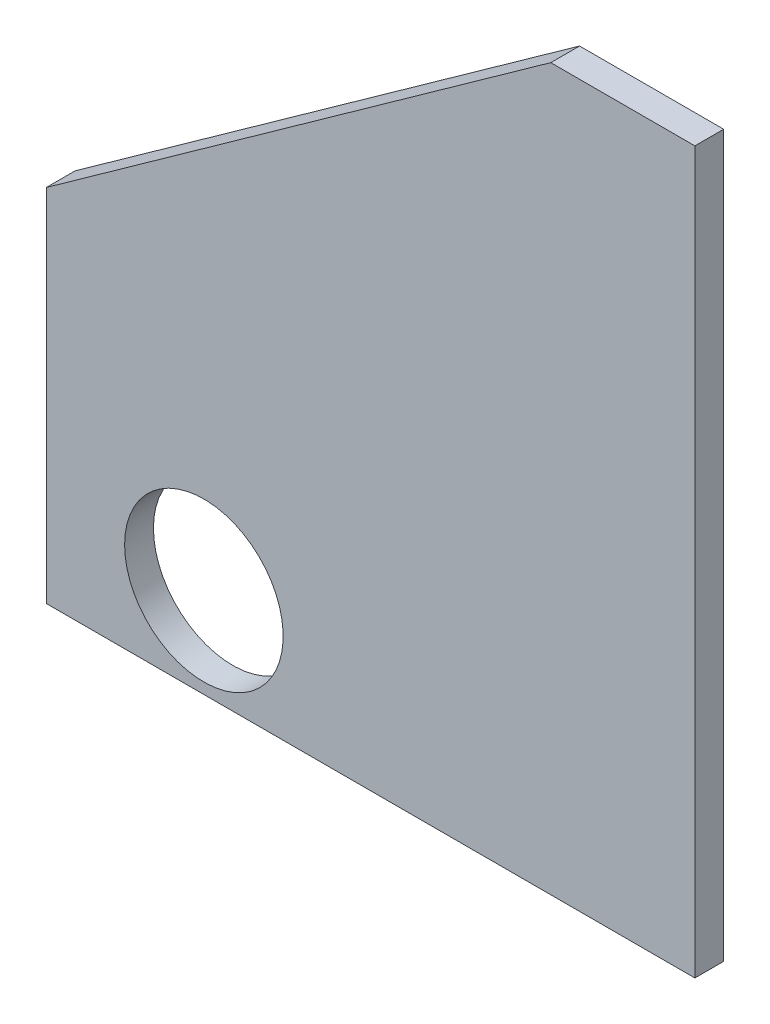
ISO-10303-21;
HEADER;
FILE_DESCRIPTION(('STEP AP214'),'2;1');
FILE_NAME('part.step','',(''),(''),'','','');
FILE_SCHEMA(('AUTOMOTIVE_DESIGN { 1 0 10303 214 1 1 1 1 }'));
ENDSEC;
DATA;
#1=APPLICATION_CONTEXT('core data for automotive mechanical design processes');
#2=APPLICATION_PROTOCOL_DEFINITION('international standard','automotive_design',2000,#1);
#3=PRODUCT_CONTEXT('',#1,'mechanical');
#4=PRODUCT('Part','Part','',(#3));
#5=PRODUCT_RELATED_PRODUCT_CATEGORY('part','',(#4));
#6=PRODUCT_DEFINITION_FORMATION('','',#4);
#7=PRODUCT_DEFINITION_CONTEXT('part definition',#1,'design');
#8=PRODUCT_DEFINITION('design','',#6,#7);
#9=PRODUCT_DEFINITION_SHAPE('','',#8);
#10=(LENGTH_UNIT() NAMED_UNIT(*) SI_UNIT(.MILLI.,.METRE.));
#11=(NAMED_UNIT(*) PLANE_ANGLE_UNIT() SI_UNIT($,.RADIAN.));
#12=(NAMED_UNIT(*) SI_UNIT($,.STERADIAN.) SOLID_ANGLE_UNIT());
#13=UNCERTAINTY_MEASURE_WITH_UNIT(LENGTH_MEASURE(1.E-05),#10,'distance_accuracy_value','');
#14=(GEOMETRIC_REPRESENTATION_CONTEXT(3) GLOBAL_UNCERTAINTY_ASSIGNED_CONTEXT((#13)) GLOBAL_UNIT_ASSIGNED_CONTEXT((#10,
#11,#12)) REPRESENTATION_CONTEXT('',''));
#15=CARTESIAN_POINT('',(0.,0.,0.));
#16=DIRECTION('',(0.,0.,1.));
#17=DIRECTION('',(1.,0.,0.));
#18=AXIS2_PLACEMENT_3D('',#15,#16,#17);
#19=CARTESIAN_POINT('',(0.,50.,4.));
#20=DIRECTION('',(1.,0.,0.));
#21=DIRECTION('',(0.,1.,0.));
#22=AXIS2_PLACEMENT_3D('',#19,#20,#21);
#23=PLANE('',#22);
#24=DIRECTION('',(0.,-1.,0.));
#25=VECTOR('',#24,1.);
#26=CARTESIAN_POINT('',(0.,50.,0.));
#27=LINE('',#26,#25);
#28=CARTESIAN_POINT('',(0.,50.,0.));
#29=VERTEX_POINT('',#28);
#30=CARTESIAN_POINT('',(0.,0.,0.));
#31=VERTEX_POINT('',#30);
#32=EDGE_CURVE('E107',#29,#31,#27,.T.);
#33=ORIENTED_EDGE('',*,*,#32,.T.);
#34=DIRECTION('',(0.,0.,-1.));
#35=VECTOR('',#34,1.);
#36=CARTESIAN_POINT('',(0.,0.,4.));
#37=LINE('',#36,#35);
#38=CARTESIAN_POINT('',(0.,0.,4.));
#39=VERTEX_POINT('',#38);
#40=EDGE_CURVE('E11',#39,#31,#37,.T.);
#41=ORIENTED_EDGE('',*,*,#40,.F.);
#42=DIRECTION('',(0.,-1.,0.));
#43=VECTOR('',#42,1.);
#44=CARTESIAN_POINT('',(0.,50.,4.));
#45=LINE('',#44,#43);
#46=CARTESIAN_POINT('',(0.,50.,4.));
#47=VERTEX_POINT('',#46);
#48=EDGE_CURVE('E116',#47,#39,#45,.T.);
#49=ORIENTED_EDGE('',*,*,#48,.F.);
#50=DIRECTION('',(0.,0.,-1.));
#51=VECTOR('',#50,1.);
#52=CARTESIAN_POINT('',(0.,50.,4.));
#53=LINE('',#52,#51);
#54=EDGE_CURVE('E103',#47,#29,#53,.T.);
#55=ORIENTED_EDGE('',*,*,#54,.T.);
#56=EDGE_LOOP('',(#33,#41,#49,#55));
#57=FACE_BOUND('',#56,.T.);
#58=ADVANCED_FACE('F33',(#57),#23,.F.);
#59=CARTESIAN_POINT('',(0.,0.,4.));
#60=DIRECTION('',(0.,1.,0.));
#61=DIRECTION('',(0.,0.,1.));
#62=AXIS2_PLACEMENT_3D('',#59,#60,#61);
#63=PLANE('',#62);
#64=DIRECTION('',(1.,0.,0.));
#65=VECTOR('',#64,1.);
#66=CARTESIAN_POINT('',(0.,0.,0.));
#67=LINE('',#66,#65);
#68=CARTESIAN_POINT('',(90.,0.,0.));
#69=VERTEX_POINT('',#68);
#70=EDGE_CURVE('E110',#31,#69,#67,.T.);
#71=ORIENTED_EDGE('',*,*,#70,.T.);
#72=DIRECTION('',(0.,0.,-1.));
#73=VECTOR('',#72,1.);
#74=CARTESIAN_POINT('',(90.,0.,4.));
#75=LINE('',#74,#73);
#76=CARTESIAN_POINT('',(90.,0.,4.));
#77=VERTEX_POINT('',#76);
#78=EDGE_CURVE('E41',#77,#69,#75,.T.);
#79=ORIENTED_EDGE('',*,*,#78,.F.);
#80=DIRECTION('',(1.,0.,0.));
#81=VECTOR('',#80,1.);
#82=CARTESIAN_POINT('',(0.,0.,4.));
#83=LINE('',#82,#81);
#84=EDGE_CURVE('E83',#39,#77,#83,.T.);
#85=ORIENTED_EDGE('',*,*,#84,.F.);
#86=ORIENTED_EDGE('',*,*,#40,.T.);
#87=EDGE_LOOP('',(#71,#79,#85,#86));
#88=FACE_BOUND('',#87,.T.);
#89=ADVANCED_FACE('F137',(#88),#63,.F.);
#90=CARTESIAN_POINT('',(90.,0.,4.));
#91=DIRECTION('',(-1.,0.,0.));
#92=DIRECTION('',(0.,0.,1.));
#93=AXIS2_PLACEMENT_3D('',#90,#91,#92);
#94=PLANE('',#93);
#95=DIRECTION('',(0.,1.,0.));
#96=VECTOR('',#95,1.);
#97=CARTESIAN_POINT('',(90.,0.,0.));
#98=LINE('',#97,#96);
#99=CARTESIAN_POINT('',(90.,100.,0.));
#100=VERTEX_POINT('',#99);
#101=EDGE_CURVE('E98',#69,#100,#98,.T.);
#102=ORIENTED_EDGE('',*,*,#101,.T.);
#103=DIRECTION('',(0.,0.,-1.));
#104=VECTOR('',#103,1.);
#105=CARTESIAN_POINT('',(90.,100.,4.));
#106=LINE('',#105,#104);
#107=CARTESIAN_POINT('',(90.,100.,4.));
#108=VERTEX_POINT('',#107);
#109=EDGE_CURVE('E95',#108,#100,#106,.T.);
#110=ORIENTED_EDGE('',*,*,#109,.F.);
#111=DIRECTION('',(0.,1.,0.));
#112=VECTOR('',#111,1.);
#113=CARTESIAN_POINT('',(90.,0.,4.));
#114=LINE('',#113,#112);
#115=EDGE_CURVE('E87',#77,#108,#114,.T.);
#116=ORIENTED_EDGE('',*,*,#115,.F.);
#117=ORIENTED_EDGE('',*,*,#78,.T.);
#118=EDGE_LOOP('',(#102,#110,#116,#117));
#119=FACE_BOUND('',#118,.T.);
#120=ADVANCED_FACE('F96',(#119),#94,.F.);
#121=CARTESIAN_POINT('',(90.,100.,4.));
#122=DIRECTION('',(0.,-1.,0.));
#123=DIRECTION('',(0.,0.,-1.));
#124=AXIS2_PLACEMENT_3D('',#121,#122,#123);
#125=PLANE('',#124);
#126=DIRECTION('',(-1.,0.,0.));
#127=VECTOR('',#126,1.);
#128=CARTESIAN_POINT('',(90.,100.,0.));
#129=LINE('',#128,#127);
#130=CARTESIAN_POINT('',(70.,100.,0.));
#131=VERTEX_POINT('',#130);
#132=EDGE_CURVE('E69',#100,#131,#129,.T.);
#133=ORIENTED_EDGE('',*,*,#132,.T.);
#134=DIRECTION('',(0.,0.,-1.));
#135=VECTOR('',#134,1.);
#136=CARTESIAN_POINT('',(70.,100.,4.));
#137=LINE('',#136,#135);
#138=CARTESIAN_POINT('',(70.,100.,4.));
#139=VERTEX_POINT('',#138);
#140=EDGE_CURVE('E99',#139,#131,#137,.T.);
#141=ORIENTED_EDGE('',*,*,#140,.F.);
#142=DIRECTION('',(-1.,0.,0.));
#143=VECTOR('',#142,1.);
#144=CARTESIAN_POINT('',(90.,100.,4.));
#145=LINE('',#144,#143);
#146=EDGE_CURVE('E91',#108,#139,#145,.T.);
#147=ORIENTED_EDGE('',*,*,#146,.F.);
#148=ORIENTED_EDGE('',*,*,#109,.T.);
#149=EDGE_LOOP('',(#133,#141,#147,#148));
#150=FACE_BOUND('',#149,.T.);
#151=ADVANCED_FACE('F101',(#150),#125,.F.);
#152=CARTESIAN_POINT('',(70.,100.,4.));
#153=DIRECTION('',(0.581238193719096,-0.813733471206735,0.));
#154=DIRECTION('',(0.813733471206735,0.581238193719096,0.));
#155=AXIS2_PLACEMENT_3D('',#152,#153,#154);
#156=PLANE('',#155);
#157=DIRECTION('',(-0.813733471206735,-0.581238193719096,0.));
#158=VECTOR('',#157,1.);
#159=CARTESIAN_POINT('',(70.,100.,0.));
#160=LINE('',#159,#158);
#161=EDGE_CURVE('E75',#131,#29,#160,.T.);
#162=ORIENTED_EDGE('',*,*,#161,.T.);
#163=ORIENTED_EDGE('',*,*,#54,.F.);
#164=DIRECTION('',(-0.813733471206735,-0.581238193719096,0.));
#165=VECTOR('',#164,1.);
#166=CARTESIAN_POINT('',(70.,100.,4.));
#167=LINE('',#166,#165);
#168=EDGE_CURVE('E49',#139,#47,#167,.T.);
#169=ORIENTED_EDGE('',*,*,#168,.F.);
#170=ORIENTED_EDGE('',*,*,#140,.T.);
#171=EDGE_LOOP('',(#162,#163,#169,#170));
#172=FACE_BOUND('',#171,.T.);
#173=ADVANCED_FACE('F124',(#172),#156,.F.);
#174=CARTESIAN_POINT('',(0.,0.,4.));
#175=DIRECTION('',(0.,0.,1.));
#176=DIRECTION('',(1.,0.,0.));
#177=AXIS2_PLACEMENT_3D('',#174,#175,#176);
#178=PLANE('',#177);
#179=CARTESIAN_POINT('',(21.8671019335835,12.5,4.));
#180=DIRECTION('',(0.,0.,-1.));
#181=DIRECTION('',(-1.,0.,0.));
#182=AXIS2_PLACEMENT_3D('',#179,#180,#181);
#183=CIRCLE('',#182,11.);
#184=CARTESIAN_POINT('',(10.8671019335835,12.5,4.));
#185=VERTEX_POINT('',#184);
#186=EDGE_CURVE('E111',#185,#185,#183,.T.);
#187=ORIENTED_EDGE('',*,*,#186,.T.);
#188=EDGE_LOOP('',(#187));
#189=FACE_BOUND('',#188,.T.);
#190=ORIENTED_EDGE('',*,*,#48,.T.);
#191=ORIENTED_EDGE('',*,*,#84,.T.);
#192=ORIENTED_EDGE('',*,*,#115,.T.);
#193=ORIENTED_EDGE('',*,*,#146,.T.);
#194=ORIENTED_EDGE('',*,*,#168,.T.);
#195=EDGE_LOOP('',(#190,#191,#192,#193,#194));
#196=FACE_BOUND('',#195,.T.);
#197=ADVANCED_FACE('F89',(#189,#196),#178,.T.);
#198=CARTESIAN_POINT('',(0.,0.,0.));
#199=DIRECTION('',(0.,0.,1.));
#200=DIRECTION('',(1.,0.,0.));
#201=AXIS2_PLACEMENT_3D('',#198,#199,#200);
#202=PLANE('',#201);
#203=CARTESIAN_POINT('',(21.8671019335835,12.5,0.));
#204=DIRECTION('',(0.,0.,-1.));
#205=DIRECTION('',(-1.,0.,0.));
#206=AXIS2_PLACEMENT_3D('',#203,#204,#205);
#207=CIRCLE('',#206,11.);
#208=CARTESIAN_POINT('',(10.8671019335835,12.5,0.));
#209=VERTEX_POINT('',#208);
#210=EDGE_CURVE('E187',#209,#209,#207,.T.);
#211=ORIENTED_EDGE('',*,*,#210,.F.);
#212=EDGE_LOOP('',(#211));
#213=FACE_BOUND('',#212,.T.);
#214=ORIENTED_EDGE('',*,*,#32,.F.);
#215=ORIENTED_EDGE('',*,*,#161,.F.);
#216=ORIENTED_EDGE('',*,*,#132,.F.);
#217=ORIENTED_EDGE('',*,*,#101,.F.);
#218=ORIENTED_EDGE('',*,*,#70,.F.);
#219=EDGE_LOOP('',(#214,#215,#216,#217,#218));
#220=FACE_BOUND('',#219,.T.);
#221=ADVANCED_FACE('F120',(#213,#220),#202,.F.);
#222=CARTESIAN_POINT('',(21.8671019335835,12.5,4.));
#223=DIRECTION('',(0.,0.,-1.));
#224=DIRECTION('',(-1.,0.,0.));
#225=AXIS2_PLACEMENT_3D('',#222,#223,#224);
#226=CYLINDRICAL_SURFACE('',#225,11.);
#227=ORIENTED_EDGE('',*,*,#186,.F.);
#228=EDGE_LOOP('',(#227));
#229=FACE_BOUND('',#228,.T.);
#230=ORIENTED_EDGE('',*,*,#210,.T.);
#231=EDGE_LOOP('',(#230));
#232=FACE_BOUND('',#231,.T.);
#233=ADVANCED_FACE('F166',(#229,#232),#226,.F.);
#234=CLOSED_SHELL('',(#58,#89,#120,#151,#173,#197,#221,#233));
#235=MANIFOLD_SOLID_BREP('B2',#234);
#236=ADVANCED_BREP_SHAPE_REPRESENTATION('',(#18,#235),#14);
#237=SHAPE_DEFINITION_REPRESENTATION(#9,#236);
ENDSEC;
END-ISO-10303-21;
